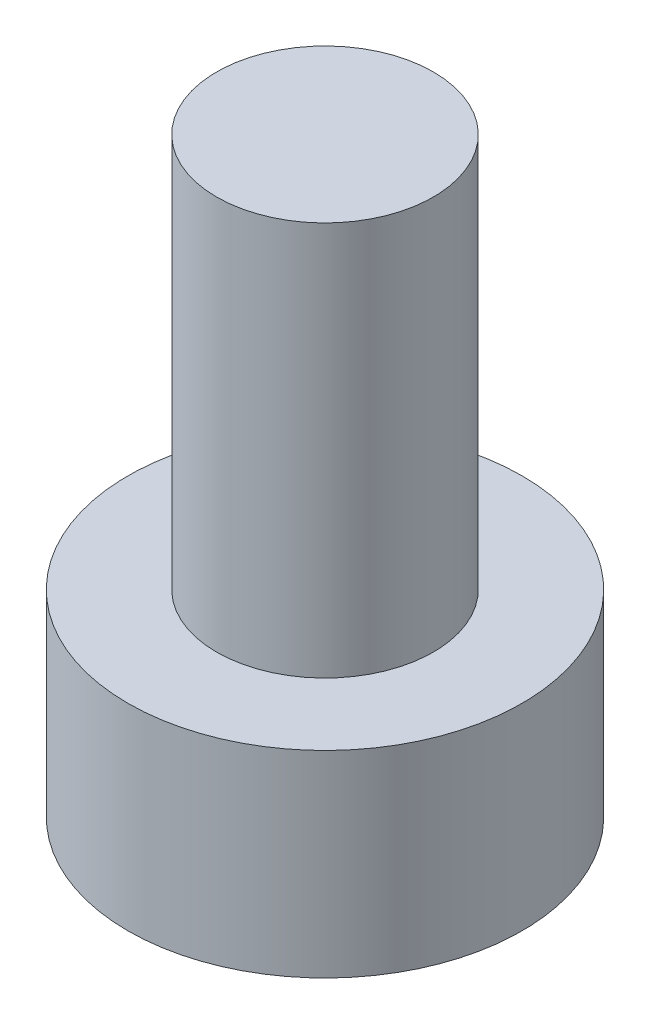
ISO-10303-21;
HEADER;
FILE_DESCRIPTION(('STEP AP214'),'2;1');
FILE_NAME('part.step','',(''),(''),'','','');
FILE_SCHEMA(('AUTOMOTIVE_DESIGN { 1 0 10303 214 1 1 1 1 }'));
ENDSEC;
DATA;
#1=APPLICATION_CONTEXT('core data for automotive mechanical design processes');
#2=APPLICATION_PROTOCOL_DEFINITION('international standard','automotive_design',2000,#1);
#3=PRODUCT_CONTEXT('',#1,'mechanical');
#4=PRODUCT('Part','Part','',(#3));
#5=PRODUCT_RELATED_PRODUCT_CATEGORY('part','',(#4));
#6=PRODUCT_DEFINITION_FORMATION('','',#4);
#7=PRODUCT_DEFINITION_CONTEXT('part definition',#1,'design');
#8=PRODUCT_DEFINITION('design','',#6,#7);
#9=PRODUCT_DEFINITION_SHAPE('','',#8);
#10=(LENGTH_UNIT() NAMED_UNIT(*) SI_UNIT(.MILLI.,.METRE.));
#11=(NAMED_UNIT(*) PLANE_ANGLE_UNIT() SI_UNIT($,.RADIAN.));
#12=(NAMED_UNIT(*) SI_UNIT($,.STERADIAN.) SOLID_ANGLE_UNIT());
#13=UNCERTAINTY_MEASURE_WITH_UNIT(LENGTH_MEASURE(1.E-05),#10,'distance_accuracy_value','');
#14=(GEOMETRIC_REPRESENTATION_CONTEXT(3) GLOBAL_UNCERTAINTY_ASSIGNED_CONTEXT((#13)) GLOBAL_UNIT_ASSIGNED_CONTEXT((#10,
#11,#12)) REPRESENTATION_CONTEXT('',''));
#15=CARTESIAN_POINT('',(0.,0.,0.));
#16=DIRECTION('',(0.,0.,1.));
#17=DIRECTION('',(1.,0.,0.));
#18=AXIS2_PLACEMENT_3D('',#15,#16,#17);
#19=CARTESIAN_POINT('',(0.,2.,0.));
#20=DIRECTION('',(0.,-1.,0.));
#21=DIRECTION('',(0.,0.,-1.));
#22=AXIS2_PLACEMENT_3D('',#19,#20,#21);
#23=CYLINDRICAL_SURFACE('',#22,2.);
#24=CARTESIAN_POINT('',(0.,2.,0.));
#25=DIRECTION('',(0.,1.,0.));
#26=DIRECTION('',(0.,0.,1.));
#27=AXIS2_PLACEMENT_3D('',#24,#25,#26);
#28=CIRCLE('',#27,2.);
#29=CARTESIAN_POINT('',(0.,2.,2.));
#30=VERTEX_POINT('',#29);
#31=EDGE_CURVE('E54',#30,#30,#28,.T.);
#32=ORIENTED_EDGE('',*,*,#31,.F.);
#33=EDGE_LOOP('',(#32));
#34=FACE_BOUND('',#33,.T.);
#35=CARTESIAN_POINT('',(0.,0.,0.));
#36=DIRECTION('',(0.,1.,0.));
#37=DIRECTION('',(0.,0.,1.));
#38=AXIS2_PLACEMENT_3D('',#35,#36,#37);
#39=CIRCLE('',#38,2.);
#40=CARTESIAN_POINT('',(0.,0.,2.));
#41=VERTEX_POINT('',#40);
#42=EDGE_CURVE('E48',#41,#41,#39,.T.);
#43=ORIENTED_EDGE('',*,*,#42,.T.);
#44=EDGE_LOOP('',(#43));
#45=FACE_BOUND('',#44,.T.);
#46=ADVANCED_FACE('F45',(#34,#45),#23,.T.);
#47=CARTESIAN_POINT('',(0.,2.,0.));
#48=DIRECTION('',(0.,1.,0.));
#49=DIRECTION('',(0.,0.,1.));
#50=AXIS2_PLACEMENT_3D('',#47,#48,#49);
#51=PLANE('',#50);
#52=CARTESIAN_POINT('',(0.,2.,0.));
#53=DIRECTION('',(0.,1.,0.));
#54=DIRECTION('',(0.,0.,1.));
#55=AXIS2_PLACEMENT_3D('',#52,#53,#54);
#56=CIRCLE('',#55,1.1);
#57=CARTESIAN_POINT('',(0.,2.,1.1));
#58=VERTEX_POINT('',#57);
#59=EDGE_CURVE('E11',#58,#58,#56,.T.);
#60=ORIENTED_EDGE('',*,*,#59,.F.);
#61=EDGE_LOOP('',(#60));
#62=FACE_BOUND('',#61,.T.);
#63=ORIENTED_EDGE('',*,*,#31,.T.);
#64=EDGE_LOOP('',(#63));
#65=FACE_BOUND('',#64,.T.);
#66=ADVANCED_FACE('F182',(#62,#65),#51,.T.);
#67=CARTESIAN_POINT('',(0.,0.,0.));
#68=DIRECTION('',(0.,1.,0.));
#69=DIRECTION('',(0.,0.,1.));
#70=AXIS2_PLACEMENT_3D('',#67,#68,#69);
#71=PLANE('',#70);
#72=DIRECTION('',(-0.421076977433653,0.,0.907024905432778));
#73=VECTOR('',#72,1.);
#74=CARTESIAN_POINT('',(1.3071022599954,0.,-0.116595976243707));
#75=LINE('',#74,#73);
#76=CARTESIAN_POINT('',(1.3071022599954,0.,-0.116595976243707));
#77=VERTEX_POINT('',#76);
#78=CARTESIAN_POINT('',(0.754526207403795,0.,1.07368577437821));
#79=VERTEX_POINT('',#78);
#80=EDGE_CURVE('E142',#77,#79,#75,.T.);
#81=ORIENTED_EDGE('',*,*,#80,.F.);
#82=DIRECTION('',(0.574968121253137,0.,0.818175812122699));
#83=VECTOR('',#82,1.);
#84=CARTESIAN_POINT('',(0.552576052591601,0.,-1.19028175062192));
#85=LINE('',#84,#83);
#86=CARTESIAN_POINT('',(0.552576052591601,0.,-1.19028175062192));
#87=VERTEX_POINT('',#86);
#88=EDGE_CURVE('E62',#87,#77,#85,.T.);
#89=ORIENTED_EDGE('',*,*,#88,.F.);
#90=DIRECTION('',(0.99604509868679,0.,-0.0888490933100781));
#91=VECTOR('',#90,1.);
#92=CARTESIAN_POINT('',(-0.754526207403796,0.,-1.07368577437821));
#93=LINE('',#92,#91);
#94=CARTESIAN_POINT('',(-0.754526207403796,0.,-1.07368577437821));
#95=VERTEX_POINT('',#94);
#96=EDGE_CURVE('E156',#95,#87,#93,.T.);
#97=ORIENTED_EDGE('',*,*,#96,.F.);
#98=DIRECTION('',(0.421076977433652,0.,-0.907024905432778));
#99=VECTOR('',#98,1.);
#100=CARTESIAN_POINT('',(-1.3071022599954,0.,0.116595976243707));
#101=LINE('',#100,#99);
#102=CARTESIAN_POINT('',(-1.3071022599954,0.,0.116595976243707));
#103=VERTEX_POINT('',#102);
#104=EDGE_CURVE('E153',#103,#95,#101,.T.);
#105=ORIENTED_EDGE('',*,*,#104,.F.);
#106=DIRECTION('',(-0.574968121253136,0.,-0.818175812122699));
#107=VECTOR('',#106,1.);
#108=CARTESIAN_POINT('',(-0.552576052591602,0.,1.19028175062192));
#109=LINE('',#108,#107);
#110=CARTESIAN_POINT('',(-0.552576052591602,0.,1.19028175062192));
#111=VERTEX_POINT('',#110);
#112=EDGE_CURVE('E110',#111,#103,#109,.T.);
#113=ORIENTED_EDGE('',*,*,#112,.F.);
#114=DIRECTION('',(-0.99604509868679,0.,0.0888490933100786));
#115=VECTOR('',#114,1.);
#116=CARTESIAN_POINT('',(0.754526207403795,0.,1.07368577437821));
#117=LINE('',#116,#115);
#118=EDGE_CURVE('E147',#79,#111,#117,.T.);
#119=ORIENTED_EDGE('',*,*,#118,.F.);
#120=EDGE_LOOP('',(#81,#89,#97,#105,#113,#119));
#121=FACE_BOUND('',#120,.T.);
#122=ORIENTED_EDGE('',*,*,#42,.F.);
#123=EDGE_LOOP('',(#122));
#124=FACE_BOUND('',#123,.T.);
#125=ADVANCED_FACE('F179',(#121,#124),#71,.F.);
#126=CARTESIAN_POINT('',(0.552576052591601,1.,-1.19028175062192));
#127=DIRECTION('',(0.818175812122699,0.,-0.574968121253137));
#128=DIRECTION('',(-0.574968121253137,0.,-0.818175812122699));
#129=AXIS2_PLACEMENT_3D('',#126,#127,#128);
#130=PLANE('',#129);
#131=ORIENTED_EDGE('',*,*,#88,.T.);
#132=DIRECTION('',(0.,-1.,0.));
#133=VECTOR('',#132,1.);
#134=CARTESIAN_POINT('',(1.3071022599954,1.,-0.116595976243707));
#135=LINE('',#134,#133);
#136=CARTESIAN_POINT('',(1.3071022599954,1.,-0.116595976243707));
#137=VERTEX_POINT('',#136);
#138=EDGE_CURVE('E92',#137,#77,#135,.T.);
#139=ORIENTED_EDGE('',*,*,#138,.F.);
#140=DIRECTION('',(0.574968121253137,0.,0.818175812122699));
#141=VECTOR('',#140,1.);
#142=CARTESIAN_POINT('',(0.552576052591601,1.,-1.19028175062192));
#143=LINE('',#142,#141);
#144=CARTESIAN_POINT('',(0.552576052591601,1.,-1.19028175062192));
#145=VERTEX_POINT('',#144);
#146=EDGE_CURVE('E159',#145,#137,#143,.T.);
#147=ORIENTED_EDGE('',*,*,#146,.F.);
#148=DIRECTION('',(0.,-1.,0.));
#149=VECTOR('',#148,1.);
#150=CARTESIAN_POINT('',(0.552576052591601,1.,-1.19028175062192));
#151=LINE('',#150,#149);
#152=EDGE_CURVE('E70',#145,#87,#151,.T.);
#153=ORIENTED_EDGE('',*,*,#152,.T.);
#154=EDGE_LOOP('',(#131,#139,#147,#153));
#155=FACE_BOUND('',#154,.T.);
#156=ADVANCED_FACE('F181',(#155),#130,.F.);
#157=CARTESIAN_POINT('',(-0.754526207403796,1.,-1.07368577437821));
#158=DIRECTION('',(-0.0888490933100781,0.,-0.99604509868679));
#159=DIRECTION('',(-0.99604509868679,0.,0.0888490933100781));
#160=AXIS2_PLACEMENT_3D('',#157,#158,#159);
#161=PLANE('',#160);
#162=ORIENTED_EDGE('',*,*,#96,.T.);
#163=ORIENTED_EDGE('',*,*,#152,.F.);
#164=DIRECTION('',(0.99604509868679,0.,-0.0888490933100781));
#165=VECTOR('',#164,1.);
#166=CARTESIAN_POINT('',(-0.754526207403796,1.,-1.07368577437821));
#167=LINE('',#166,#165);
#168=CARTESIAN_POINT('',(-0.754526207403796,1.,-1.07368577437821));
#169=VERTEX_POINT('',#168);
#170=EDGE_CURVE('E124',#169,#145,#167,.T.);
#171=ORIENTED_EDGE('',*,*,#170,.F.);
#172=DIRECTION('',(0.,-1.,0.));
#173=VECTOR('',#172,1.);
#174=CARTESIAN_POINT('',(-0.754526207403796,1.,-1.07368577437821));
#175=LINE('',#174,#173);
#176=EDGE_CURVE('E115',#169,#95,#175,.T.);
#177=ORIENTED_EDGE('',*,*,#176,.T.);
#178=EDGE_LOOP('',(#162,#163,#171,#177));
#179=FACE_BOUND('',#178,.T.);
#180=ADVANCED_FACE('F188',(#179),#161,.F.);
#181=CARTESIAN_POINT('',(-1.3071022599954,1.,0.116595976243707));
#182=DIRECTION('',(-0.907024905432778,0.,-0.421076977433652));
#183=DIRECTION('',(-0.421076977433652,0.,0.907024905432778));
#184=AXIS2_PLACEMENT_3D('',#181,#182,#183);
#185=PLANE('',#184);
#186=ORIENTED_EDGE('',*,*,#104,.T.);
#187=ORIENTED_EDGE('',*,*,#176,.F.);
#188=DIRECTION('',(0.421076977433652,0.,-0.907024905432778));
#189=VECTOR('',#188,1.);
#190=CARTESIAN_POINT('',(-1.3071022599954,1.,0.116595976243707));
#191=LINE('',#190,#189);
#192=CARTESIAN_POINT('',(-1.3071022599954,1.,0.116595976243707));
#193=VERTEX_POINT('',#192);
#194=EDGE_CURVE('E119',#193,#169,#191,.T.);
#195=ORIENTED_EDGE('',*,*,#194,.F.);
#196=DIRECTION('',(0.,-1.,0.));
#197=VECTOR('',#196,1.);
#198=CARTESIAN_POINT('',(-1.3071022599954,1.,0.116595976243707));
#199=LINE('',#198,#197);
#200=EDGE_CURVE('E103',#193,#103,#199,.T.);
#201=ORIENTED_EDGE('',*,*,#200,.T.);
#202=EDGE_LOOP('',(#186,#187,#195,#201));
#203=FACE_BOUND('',#202,.T.);
#204=ADVANCED_FACE('F120',(#203),#185,.F.);
#205=CARTESIAN_POINT('',(-0.552576052591602,1.,1.19028175062192));
#206=DIRECTION('',(-0.8181758121227,0.,0.574968121253136));
#207=DIRECTION('',(0.574968121253136,0.,0.818175812122699));
#208=AXIS2_PLACEMENT_3D('',#205,#206,#207);
#209=PLANE('',#208);
#210=ORIENTED_EDGE('',*,*,#112,.T.);
#211=ORIENTED_EDGE('',*,*,#200,.F.);
#212=DIRECTION('',(-0.574968121253136,0.,-0.818175812122699));
#213=VECTOR('',#212,1.);
#214=CARTESIAN_POINT('',(-0.552576052591602,1.,1.19028175062192));
#215=LINE('',#214,#213);
#216=CARTESIAN_POINT('',(-0.552576052591602,1.,1.19028175062192));
#217=VERTEX_POINT('',#216);
#218=EDGE_CURVE('E107',#217,#193,#215,.T.);
#219=ORIENTED_EDGE('',*,*,#218,.F.);
#220=DIRECTION('',(0.,-1.,0.));
#221=VECTOR('',#220,1.);
#222=CARTESIAN_POINT('',(-0.552576052591602,1.,1.19028175062192));
#223=LINE('',#222,#221);
#224=EDGE_CURVE('E116',#217,#111,#223,.T.);
#225=ORIENTED_EDGE('',*,*,#224,.T.);
#226=EDGE_LOOP('',(#210,#211,#219,#225));
#227=FACE_BOUND('',#226,.T.);
#228=ADVANCED_FACE('F105',(#227),#209,.F.);
#229=CARTESIAN_POINT('',(0.754526207403795,1.,1.07368577437821));
#230=DIRECTION('',(0.0888490933100786,0.,0.99604509868679));
#231=DIRECTION('',(0.99604509868679,0.,-0.0888490933100786));
#232=AXIS2_PLACEMENT_3D('',#229,#230,#231);
#233=PLANE('',#232);
#234=ORIENTED_EDGE('',*,*,#118,.T.);
#235=ORIENTED_EDGE('',*,*,#224,.F.);
#236=DIRECTION('',(-0.99604509868679,0.,0.0888490933100786));
#237=VECTOR('',#236,1.);
#238=CARTESIAN_POINT('',(0.754526207403795,1.,1.07368577437821));
#239=LINE('',#238,#237);
#240=CARTESIAN_POINT('',(0.754526207403795,1.,1.07368577437821));
#241=VERTEX_POINT('',#240);
#242=EDGE_CURVE('E130',#241,#217,#239,.T.);
#243=ORIENTED_EDGE('',*,*,#242,.F.);
#244=DIRECTION('',(0.,-1.,0.));
#245=VECTOR('',#244,1.);
#246=CARTESIAN_POINT('',(0.754526207403795,1.,1.07368577437821));
#247=LINE('',#246,#245);
#248=EDGE_CURVE('E166',#241,#79,#247,.T.);
#249=ORIENTED_EDGE('',*,*,#248,.T.);
#250=EDGE_LOOP('',(#234,#235,#243,#249));
#251=FACE_BOUND('',#250,.T.);
#252=ADVANCED_FACE('F241',(#251),#233,.F.);
#253=CARTESIAN_POINT('',(1.3071022599954,1.,-0.116595976243707));
#254=DIRECTION('',(0.907024905432778,0.,0.421076977433653));
#255=DIRECTION('',(0.421076977433653,0.,-0.907024905432778));
#256=AXIS2_PLACEMENT_3D('',#253,#254,#255);
#257=PLANE('',#256);
#258=ORIENTED_EDGE('',*,*,#80,.T.);
#259=ORIENTED_EDGE('',*,*,#248,.F.);
#260=DIRECTION('',(-0.421076977433653,0.,0.907024905432778));
#261=VECTOR('',#260,1.);
#262=CARTESIAN_POINT('',(1.3071022599954,1.,-0.116595976243707));
#263=LINE('',#262,#261);
#264=EDGE_CURVE('E134',#137,#241,#263,.T.);
#265=ORIENTED_EDGE('',*,*,#264,.F.);
#266=ORIENTED_EDGE('',*,*,#138,.T.);
#267=EDGE_LOOP('',(#258,#259,#265,#266));
#268=FACE_BOUND('',#267,.T.);
#269=ADVANCED_FACE('F250',(#268),#257,.F.);
#270=CARTESIAN_POINT('',(0.,1.,0.));
#271=DIRECTION('',(0.,-1.,0.));
#272=DIRECTION('',(0.,0.,-1.));
#273=AXIS2_PLACEMENT_3D('',#270,#271,#272);
#274=PLANE('',#273);
#275=ORIENTED_EDGE('',*,*,#146,.T.);
#276=ORIENTED_EDGE('',*,*,#264,.T.);
#277=ORIENTED_EDGE('',*,*,#242,.T.);
#278=ORIENTED_EDGE('',*,*,#218,.T.);
#279=ORIENTED_EDGE('',*,*,#194,.T.);
#280=ORIENTED_EDGE('',*,*,#170,.T.);
#281=EDGE_LOOP('',(#275,#276,#277,#278,#279,#280));
#282=FACE_BOUND('',#281,.T.);
#283=ADVANCED_FACE('F127',(#282),#274,.T.);
#284=CARTESIAN_POINT('',(0.,6.,0.));
#285=DIRECTION('',(0.,-1.,0.));
#286=DIRECTION('',(0.,0.,-1.));
#287=AXIS2_PLACEMENT_3D('',#284,#285,#286);
#288=CYLINDRICAL_SURFACE('',#287,1.1);
#289=CARTESIAN_POINT('',(0.,6.,0.));
#290=DIRECTION('',(0.,1.,0.));
#291=DIRECTION('',(0.,0.,1.));
#292=AXIS2_PLACEMENT_3D('',#289,#290,#291);
#293=CIRCLE('',#292,1.1);
#294=CARTESIAN_POINT('',(0.,6.,1.1));
#295=VERTEX_POINT('',#294);
#296=EDGE_CURVE('E143',#295,#295,#293,.T.);
#297=ORIENTED_EDGE('',*,*,#296,.F.);
#298=EDGE_LOOP('',(#297));
#299=FACE_BOUND('',#298,.T.);
#300=ORIENTED_EDGE('',*,*,#59,.T.);
#301=EDGE_LOOP('',(#300));
#302=FACE_BOUND('',#301,.T.);
#303=ADVANCED_FACE('F268',(#299,#302),#288,.T.);
#304=CARTESIAN_POINT('',(0.,6.,0.));
#305=DIRECTION('',(0.,1.,0.));
#306=DIRECTION('',(0.,0.,1.));
#307=AXIS2_PLACEMENT_3D('',#304,#305,#306);
#308=PLANE('',#307);
#309=ORIENTED_EDGE('',*,*,#296,.T.);
#310=EDGE_LOOP('',(#309));
#311=FACE_BOUND('',#310,.T.);
#312=ADVANCED_FACE('F276',(#311),#308,.T.);
#313=CLOSED_SHELL('',(#46,#66,#125,#156,#180,#204,#228,#252,#269,#283,#303,#312));
#314=MANIFOLD_SOLID_BREP('B2',#313);
#315=ADVANCED_BREP_SHAPE_REPRESENTATION('',(#18,#314),#14);
#316=SHAPE_DEFINITION_REPRESENTATION(#9,#315);
ENDSEC;
END-ISO-10303-21;
